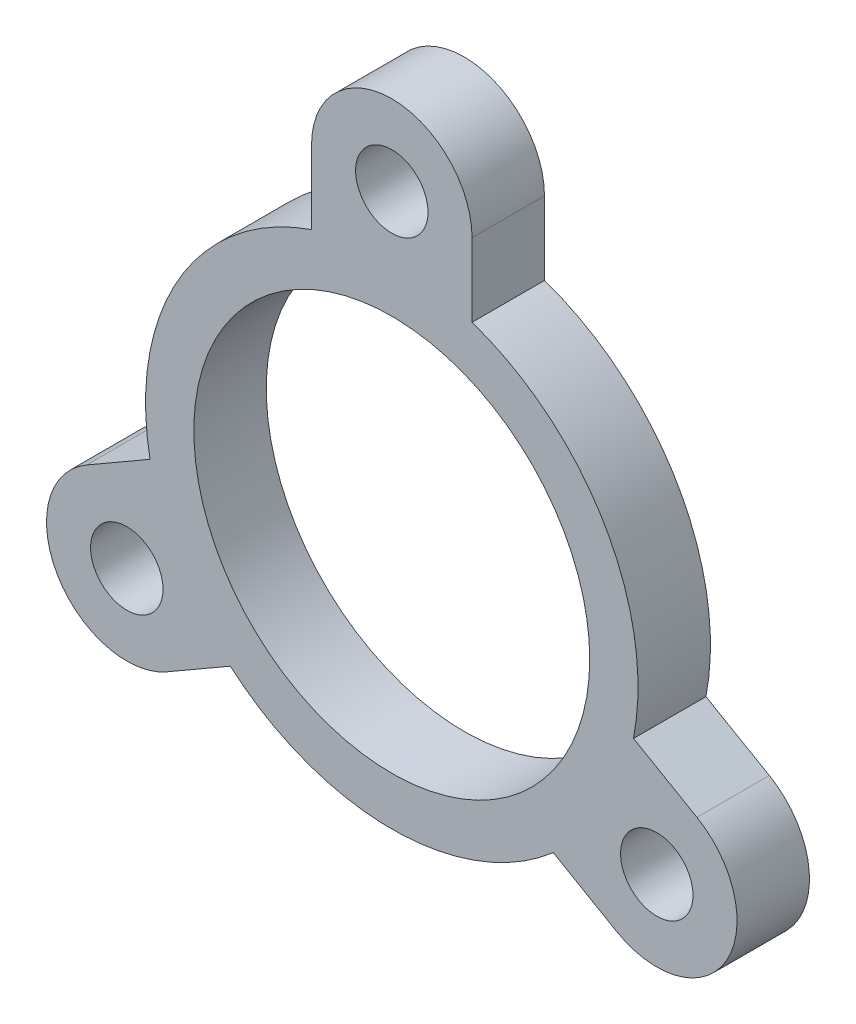
ISO-10303-21;
HEADER;
FILE_DESCRIPTION(('STEP AP214'),'2;1');
FILE_NAME('part.step','',(''),(''),'','','');
FILE_SCHEMA(('AUTOMOTIVE_DESIGN { 1 0 10303 214 1 1 1 1 }'));
ENDSEC;
DATA;
#1=APPLICATION_CONTEXT('core data for automotive mechanical design processes');
#2=APPLICATION_PROTOCOL_DEFINITION('international standard','automotive_design',2000,#1);
#3=PRODUCT_CONTEXT('',#1,'mechanical');
#4=PRODUCT('Part','Part','',(#3));
#5=PRODUCT_RELATED_PRODUCT_CATEGORY('part','',(#4));
#6=PRODUCT_DEFINITION_FORMATION('','',#4);
#7=PRODUCT_DEFINITION_CONTEXT('part definition',#1,'design');
#8=PRODUCT_DEFINITION('design','',#6,#7);
#9=PRODUCT_DEFINITION_SHAPE('','',#8);
#10=(LENGTH_UNIT() NAMED_UNIT(*) SI_UNIT(.MILLI.,.METRE.));
#11=(NAMED_UNIT(*) PLANE_ANGLE_UNIT() SI_UNIT($,.RADIAN.));
#12=(NAMED_UNIT(*) SI_UNIT($,.STERADIAN.) SOLID_ANGLE_UNIT());
#13=UNCERTAINTY_MEASURE_WITH_UNIT(LENGTH_MEASURE(1.E-05),#10,'distance_accuracy_value','');
#14=(GEOMETRIC_REPRESENTATION_CONTEXT(3) GLOBAL_UNCERTAINTY_ASSIGNED_CONTEXT((#13)) GLOBAL_UNIT_ASSIGNED_CONTEXT((#10,
#11,#12)) REPRESENTATION_CONTEXT('',''));
#15=CARTESIAN_POINT('',(0.,0.,0.));
#16=DIRECTION('',(0.,0.,1.));
#17=DIRECTION('',(1.,0.,0.));
#18=AXIS2_PLACEMENT_3D('',#15,#16,#17);
#19=CARTESIAN_POINT('',(0.,0.,1.5));
#20=DIRECTION('',(0.,0.,-1.));
#21=DIRECTION('',(-1.,0.,0.));
#22=AXIS2_PLACEMENT_3D('',#19,#20,#21);
#23=CYLINDRICAL_SURFACE('',#22,10.2);
#24=CARTESIAN_POINT('',(0.,0.,-1.5));
#25=DIRECTION('',(0.,0.,1.));
#26=DIRECTION('',(1.,0.,0.));
#27=AXIS2_PLACEMENT_3D('',#24,#25,#26);
#28=CIRCLE('',#27,10.2);
#29=CARTESIAN_POINT('',(-6.6884449315632,-7.70095477180891,-1.5));
#30=VERTEX_POINT('',#29);
#31=CARTESIAN_POINT('',(6.6884449315631,-7.70095477180901,-1.5));
#32=VERTEX_POINT('',#31);
#33=EDGE_CURVE('E170',#30,#32,#28,.T.);
#34=ORIENTED_EDGE('',*,*,#33,.T.);
#35=DIRECTION('',(0.,0.,-1.));
#36=VECTOR('',#35,1.);
#37=CARTESIAN_POINT('',(6.6884449315631,-7.70095477180901,1.5));
#38=LINE('',#37,#36);
#39=CARTESIAN_POINT('',(6.6884449315631,-7.70095477180901,1.5));
#40=VERTEX_POINT('',#39);
#41=EDGE_CURVE('E11',#40,#32,#38,.T.);
#42=ORIENTED_EDGE('',*,*,#41,.F.);
#43=CARTESIAN_POINT('',(0.,0.,1.5));
#44=DIRECTION('',(0.,0.,1.));
#45=DIRECTION('',(1.,0.,0.));
#46=AXIS2_PLACEMENT_3D('',#43,#44,#45);
#47=CIRCLE('',#46,10.2);
#48=CARTESIAN_POINT('',(-6.6884449315632,-7.70095477180891,1.5));
#49=VERTEX_POINT('',#48);
#50=EDGE_CURVE('E104',#49,#40,#47,.T.);
#51=ORIENTED_EDGE('',*,*,#50,.F.);
#52=DIRECTION('',(0.,0.,-1.));
#53=VECTOR('',#52,1.);
#54=CARTESIAN_POINT('',(-6.6884449315632,-7.70095477180891,1.5));
#55=LINE('',#54,#53);
#56=EDGE_CURVE('E166',#49,#30,#55,.T.);
#57=ORIENTED_EDGE('',*,*,#56,.T.);
#58=EDGE_LOOP('',(#34,#42,#51,#57));
#59=FACE_BOUND('',#58,.T.);
#60=ADVANCED_FACE('F36',(#59),#23,.T.);
#61=CARTESIAN_POINT('',(-1.66250000000001,-2.87953446758325,1.5));
#62=DIRECTION('',(-0.500000000000004,-0.866025403784436,0.));
#63=DIRECTION('',(0.866025403784436,-0.500000000000004,0.));
#64=AXIS2_PLACEMENT_3D('',#61,#62,#63);
#65=PLANE('',#64);
#66=DIRECTION('',(-0.866025403784436,0.500000000000004,0.));
#67=VECTOR('',#66,1.);
#68=CARTESIAN_POINT('',(-1.66250000000001,-2.87953446758325,-1.5));
#69=LINE('',#68,#67);
#70=CARTESIAN_POINT('',(9.31437199296772,-9.2170344675833,-1.5));
#71=VERTEX_POINT('',#70);
#72=EDGE_CURVE('E173',#71,#32,#69,.T.);
#73=ORIENTED_EDGE('',*,*,#72,.F.);
#74=DIRECTION('',(0.,0.,-1.));
#75=VECTOR('',#74,1.);
#76=CARTESIAN_POINT('',(9.31437199296772,-9.2170344675833,1.5));
#77=LINE('',#76,#75);
#78=CARTESIAN_POINT('',(9.31437199296772,-9.2170344675833,1.5));
#79=VERTEX_POINT('',#78);
#80=EDGE_CURVE('E45',#79,#71,#77,.T.);
#81=ORIENTED_EDGE('',*,*,#80,.F.);
#82=DIRECTION('',(-0.866025403784436,0.500000000000004,0.));
#83=VECTOR('',#82,1.);
#84=CARTESIAN_POINT('',(-1.66250000000001,-2.87953446758325,1.5));
#85=LINE('',#84,#83);
#86=EDGE_CURVE('E240',#79,#40,#85,.T.);
#87=ORIENTED_EDGE('',*,*,#86,.T.);
#88=ORIENTED_EDGE('',*,*,#41,.T.);
#89=EDGE_LOOP('',(#73,#81,#87,#88));
#90=FACE_BOUND('',#89,.T.);
#91=ADVANCED_FACE('F239',(#90),#65,.T.);
#92=CARTESIAN_POINT('',(10.9768719929677,-6.33750000000005,1.5));
#93=DIRECTION('',(0.,0.,-1.));
#94=DIRECTION('',(-1.,0.,0.));
#95=AXIS2_PLACEMENT_3D('',#92,#93,#94);
#96=CYLINDRICAL_SURFACE('',#95,3.325);
#97=CARTESIAN_POINT('',(10.9768719929677,-6.33750000000005,-1.5));
#98=DIRECTION('',(0.,0.,1.));
#99=DIRECTION('',(1.,0.,0.));
#100=AXIS2_PLACEMENT_3D('',#97,#98,#99);
#101=CIRCLE('',#100,3.325);
#102=CARTESIAN_POINT('',(12.6393719929677,-3.4579655324168,-1.5));
#103=VERTEX_POINT('',#102);
#104=EDGE_CURVE('E176',#71,#103,#101,.T.);
#105=ORIENTED_EDGE('',*,*,#104,.T.);
#106=DIRECTION('',(0.,0.,-1.));
#107=VECTOR('',#106,1.);
#108=CARTESIAN_POINT('',(12.6393719929677,-3.4579655324168,1.5));
#109=LINE('',#108,#107);
#110=CARTESIAN_POINT('',(12.6393719929677,-3.4579655324168,1.5));
#111=VERTEX_POINT('',#110);
#112=EDGE_CURVE('E222',#111,#103,#109,.T.);
#113=ORIENTED_EDGE('',*,*,#112,.F.);
#114=CARTESIAN_POINT('',(10.9768719929677,-6.33750000000005,1.5));
#115=DIRECTION('',(0.,0.,1.));
#116=DIRECTION('',(1.,0.,0.));
#117=AXIS2_PLACEMENT_3D('',#114,#115,#116);
#118=CIRCLE('',#117,3.325);
#119=EDGE_CURVE('E229',#79,#111,#118,.T.);
#120=ORIENTED_EDGE('',*,*,#119,.F.);
#121=ORIENTED_EDGE('',*,*,#80,.T.);
#122=EDGE_LOOP('',(#105,#113,#120,#121));
#123=FACE_BOUND('',#122,.T.);
#124=ADVANCED_FACE('F227',(#123),#96,.T.);
#125=CARTESIAN_POINT('',(1.66250000000001,2.87953446758325,1.5));
#126=DIRECTION('',(-0.500000000000004,-0.866025403784436,0.));
#127=DIRECTION('',(0.866025403784436,-0.500000000000004,0.));
#128=AXIS2_PLACEMENT_3D('',#125,#126,#127);
#129=PLANE('',#128);
#130=DIRECTION('',(-0.866025403784436,0.500000000000004,0.));
#131=VECTOR('',#130,1.);
#132=CARTESIAN_POINT('',(1.66250000000001,2.87953446758325,-1.5));
#133=LINE('',#132,#131);
#134=CARTESIAN_POINT('',(10.0134449315631,-1.9418858366425,-1.5));
#135=VERTEX_POINT('',#134);
#136=EDGE_CURVE('E178',#103,#135,#133,.T.);
#137=ORIENTED_EDGE('',*,*,#136,.T.);
#138=DIRECTION('',(0.,0.,-1.));
#139=VECTOR('',#138,1.);
#140=CARTESIAN_POINT('',(10.0134449315631,-1.9418858366425,1.5));
#141=LINE('',#140,#139);
#142=CARTESIAN_POINT('',(10.0134449315631,-1.9418858366425,1.5));
#143=VERTEX_POINT('',#142);
#144=EDGE_CURVE('E219',#143,#135,#141,.T.);
#145=ORIENTED_EDGE('',*,*,#144,.F.);
#146=DIRECTION('',(-0.866025403784436,0.500000000000004,0.));
#147=VECTOR('',#146,1.);
#148=CARTESIAN_POINT('',(1.66250000000001,2.87953446758325,1.5));
#149=LINE('',#148,#147);
#150=EDGE_CURVE('E271',#111,#143,#149,.T.);
#151=ORIENTED_EDGE('',*,*,#150,.F.);
#152=ORIENTED_EDGE('',*,*,#112,.T.);
#153=EDGE_LOOP('',(#137,#145,#151,#152));
#154=FACE_BOUND('',#153,.T.);
#155=ADVANCED_FACE('F270',(#154),#129,.F.);
#156=CARTESIAN_POINT('',(0.,0.,1.5));
#157=DIRECTION('',(0.,0.,-1.));
#158=DIRECTION('',(-1.,0.,0.));
#159=AXIS2_PLACEMENT_3D('',#156,#157,#158);
#160=CYLINDRICAL_SURFACE('',#159,10.2);
#161=CARTESIAN_POINT('',(0.,0.,-1.5));
#162=DIRECTION('',(0.,0.,1.));
#163=DIRECTION('',(1.,0.,0.));
#164=AXIS2_PLACEMENT_3D('',#161,#162,#163);
#165=CIRCLE('',#164,10.2);
#166=CARTESIAN_POINT('',(3.325,9.64284060845143,-1.5));
#167=VERTEX_POINT('',#166);
#168=EDGE_CURVE('E180',#135,#167,#165,.T.);
#169=ORIENTED_EDGE('',*,*,#168,.T.);
#170=DIRECTION('',(0.,0.,-1.));
#171=VECTOR('',#170,1.);
#172=CARTESIAN_POINT('',(3.325,9.64284060845143,1.5));
#173=LINE('',#172,#171);
#174=CARTESIAN_POINT('',(3.325,9.64284060845143,1.5));
#175=VERTEX_POINT('',#174);
#176=EDGE_CURVE('E217',#175,#167,#173,.T.);
#177=ORIENTED_EDGE('',*,*,#176,.F.);
#178=CARTESIAN_POINT('',(0.,0.,1.5));
#179=DIRECTION('',(0.,0.,1.));
#180=DIRECTION('',(1.,0.,0.));
#181=AXIS2_PLACEMENT_3D('',#178,#179,#180);
#182=CIRCLE('',#181,10.2);
#183=EDGE_CURVE('E267',#143,#175,#182,.T.);
#184=ORIENTED_EDGE('',*,*,#183,.F.);
#185=ORIENTED_EDGE('',*,*,#144,.T.);
#186=EDGE_LOOP('',(#169,#177,#184,#185));
#187=FACE_BOUND('',#186,.T.);
#188=ADVANCED_FACE('F265',(#187),#160,.T.);
#189=CARTESIAN_POINT('',(3.325,0.,1.5));
#190=DIRECTION('',(1.,0.,0.));
#191=DIRECTION('',(0.,1.,0.));
#192=AXIS2_PLACEMENT_3D('',#189,#190,#191);
#193=PLANE('',#192);
#194=DIRECTION('',(0.,-1.,0.));
#195=VECTOR('',#194,1.);
#196=CARTESIAN_POINT('',(3.325,0.,-1.5));
#197=LINE('',#196,#195);
#198=CARTESIAN_POINT('',(3.325,12.675,-1.5));
#199=VERTEX_POINT('',#198);
#200=EDGE_CURVE('E183',#199,#167,#197,.T.);
#201=ORIENTED_EDGE('',*,*,#200,.F.);
#202=DIRECTION('',(0.,0.,-1.));
#203=VECTOR('',#202,1.);
#204=CARTESIAN_POINT('',(3.325,12.675,1.5));
#205=LINE('',#204,#203);
#206=CARTESIAN_POINT('',(3.325,12.675,1.5));
#207=VERTEX_POINT('',#206);
#208=EDGE_CURVE('E215',#207,#199,#205,.T.);
#209=ORIENTED_EDGE('',*,*,#208,.F.);
#210=DIRECTION('',(0.,-1.,0.));
#211=VECTOR('',#210,1.);
#212=CARTESIAN_POINT('',(3.325,0.,1.5));
#213=LINE('',#212,#211);
#214=EDGE_CURVE('E262',#207,#175,#213,.T.);
#215=ORIENTED_EDGE('',*,*,#214,.T.);
#216=ORIENTED_EDGE('',*,*,#176,.T.);
#217=EDGE_LOOP('',(#201,#209,#215,#216));
#218=FACE_BOUND('',#217,.T.);
#219=ADVANCED_FACE('F259',(#218),#193,.T.);
#220=CARTESIAN_POINT('',(0.,12.675,1.5));
#221=DIRECTION('',(0.,0.,-1.));
#222=DIRECTION('',(-1.,0.,0.));
#223=AXIS2_PLACEMENT_3D('',#220,#221,#222);
#224=CYLINDRICAL_SURFACE('',#223,3.325);
#225=CARTESIAN_POINT('',(0.,12.675,-1.5));
#226=DIRECTION('',(0.,0.,1.));
#227=DIRECTION('',(1.,0.,0.));
#228=AXIS2_PLACEMENT_3D('',#225,#226,#227);
#229=CIRCLE('',#228,3.325);
#230=CARTESIAN_POINT('',(-3.325,12.675,-1.5));
#231=VERTEX_POINT('',#230);
#232=EDGE_CURVE('E186',#199,#231,#229,.T.);
#233=ORIENTED_EDGE('',*,*,#232,.T.);
#234=DIRECTION('',(0.,0.,-1.));
#235=VECTOR('',#234,1.);
#236=CARTESIAN_POINT('',(-3.325,12.675,1.5));
#237=LINE('',#236,#235);
#238=CARTESIAN_POINT('',(-3.325,12.675,1.5));
#239=VERTEX_POINT('',#238);
#240=EDGE_CURVE('E212',#239,#231,#237,.T.);
#241=ORIENTED_EDGE('',*,*,#240,.F.);
#242=CARTESIAN_POINT('',(0.,12.675,1.5));
#243=DIRECTION('',(0.,0.,1.));
#244=DIRECTION('',(1.,0.,0.));
#245=AXIS2_PLACEMENT_3D('',#242,#243,#244);
#246=CIRCLE('',#245,3.325);
#247=EDGE_CURVE('E255',#207,#239,#246,.T.);
#248=ORIENTED_EDGE('',*,*,#247,.F.);
#249=ORIENTED_EDGE('',*,*,#208,.T.);
#250=EDGE_LOOP('',(#233,#241,#248,#249));
#251=FACE_BOUND('',#250,.T.);
#252=ADVANCED_FACE('F254',(#251),#224,.T.);
#253=CARTESIAN_POINT('',(-3.325,0.,1.5));
#254=DIRECTION('',(1.,0.,0.));
#255=DIRECTION('',(0.,1.,0.));
#256=AXIS2_PLACEMENT_3D('',#253,#254,#255);
#257=PLANE('',#256);
#258=DIRECTION('',(0.,-1.,0.));
#259=VECTOR('',#258,1.);
#260=CARTESIAN_POINT('',(-3.325,0.,-1.5));
#261=LINE('',#260,#259);
#262=CARTESIAN_POINT('',(-3.325,9.64284060845143,-1.5));
#263=VERTEX_POINT('',#262);
#264=EDGE_CURVE('E188',#231,#263,#261,.T.);
#265=ORIENTED_EDGE('',*,*,#264,.T.);
#266=DIRECTION('',(0.,0.,-1.));
#267=VECTOR('',#266,1.);
#268=CARTESIAN_POINT('',(-3.325,9.64284060845143,1.5));
#269=LINE('',#268,#267);
#270=CARTESIAN_POINT('',(-3.325,9.64284060845143,1.5));
#271=VERTEX_POINT('',#270);
#272=EDGE_CURVE('E209',#271,#263,#269,.T.);
#273=ORIENTED_EDGE('',*,*,#272,.F.);
#274=DIRECTION('',(0.,-1.,0.));
#275=VECTOR('',#274,1.);
#276=CARTESIAN_POINT('',(-3.325,0.,1.5));
#277=LINE('',#276,#275);
#278=EDGE_CURVE('E152',#239,#271,#277,.T.);
#279=ORIENTED_EDGE('',*,*,#278,.F.);
#280=ORIENTED_EDGE('',*,*,#240,.T.);
#281=EDGE_LOOP('',(#265,#273,#279,#280));
#282=FACE_BOUND('',#281,.T.);
#283=ADVANCED_FACE('F250',(#282),#257,.F.);
#284=CARTESIAN_POINT('',(0.,0.,1.5));
#285=DIRECTION('',(0.,0.,-1.));
#286=DIRECTION('',(-1.,0.,0.));
#287=AXIS2_PLACEMENT_3D('',#284,#285,#286);
#288=CYLINDRICAL_SURFACE('',#287,10.2);
#289=CARTESIAN_POINT('',(0.,0.,-1.5));
#290=DIRECTION('',(0.,0.,1.));
#291=DIRECTION('',(1.,0.,0.));
#292=AXIS2_PLACEMENT_3D('',#289,#290,#291);
#293=CIRCLE('',#292,10.2);
#294=CARTESIAN_POINT('',(-10.0134449315632,-1.94188583664236,-1.5));
#295=VERTEX_POINT('',#294);
#296=EDGE_CURVE('E190',#263,#295,#293,.T.);
#297=ORIENTED_EDGE('',*,*,#296,.T.);
#298=DIRECTION('',(0.,0.,-1.));
#299=VECTOR('',#298,1.);
#300=CARTESIAN_POINT('',(-10.0134449315632,-1.94188583664236,1.5));
#301=LINE('',#300,#299);
#302=CARTESIAN_POINT('',(-10.0134449315632,-1.94188583664236,1.5));
#303=VERTEX_POINT('',#302);
#304=EDGE_CURVE('E140',#303,#295,#301,.T.);
#305=ORIENTED_EDGE('',*,*,#304,.F.);
#306=CARTESIAN_POINT('',(0.,0.,1.5));
#307=DIRECTION('',(0.,0.,1.));
#308=DIRECTION('',(1.,0.,0.));
#309=AXIS2_PLACEMENT_3D('',#306,#307,#308);
#310=CIRCLE('',#309,10.2);
#311=EDGE_CURVE('E149',#271,#303,#310,.T.);
#312=ORIENTED_EDGE('',*,*,#311,.F.);
#313=ORIENTED_EDGE('',*,*,#272,.T.);
#314=EDGE_LOOP('',(#297,#305,#312,#313));
#315=FACE_BOUND('',#314,.T.);
#316=ADVANCED_FACE('F246',(#315),#288,.T.);
#317=CARTESIAN_POINT('',(-1.66249999999998,2.87953446758328,1.5));
#318=DIRECTION('',(-0.499999999999992,0.866025403784443,0.));
#319=DIRECTION('',(-0.866025403784443,-0.499999999999992,0.));
#320=AXIS2_PLACEMENT_3D('',#317,#318,#319);
#321=PLANE('',#320);
#322=DIRECTION('',(0.866025403784443,0.499999999999992,0.));
#323=VECTOR('',#322,1.);
#324=CARTESIAN_POINT('',(-1.66249999999998,2.87953446758328,-1.5));
#325=LINE('',#324,#323);
#326=CARTESIAN_POINT('',(-12.6393719929678,-3.45796553241662,-1.5));
#327=VERTEX_POINT('',#326);
#328=EDGE_CURVE('E139',#327,#295,#325,.T.);
#329=ORIENTED_EDGE('',*,*,#328,.F.);
#330=DIRECTION('',(0.,0.,-1.));
#331=VECTOR('',#330,1.);
#332=CARTESIAN_POINT('',(-12.6393719929678,-3.45796553241662,1.5));
#333=LINE('',#332,#331);
#334=CARTESIAN_POINT('',(-12.6393719929678,-3.45796553241662,1.5));
#335=VERTEX_POINT('',#334);
#336=EDGE_CURVE('E133',#335,#327,#333,.T.);
#337=ORIENTED_EDGE('',*,*,#336,.F.);
#338=DIRECTION('',(0.866025403784443,0.499999999999992,0.));
#339=VECTOR('',#338,1.);
#340=CARTESIAN_POINT('',(-1.66249999999998,2.87953446758328,1.5));
#341=LINE('',#340,#339);
#342=EDGE_CURVE('E137',#335,#303,#341,.T.);
#343=ORIENTED_EDGE('',*,*,#342,.T.);
#344=ORIENTED_EDGE('',*,*,#304,.T.);
#345=EDGE_LOOP('',(#329,#337,#343,#344));
#346=FACE_BOUND('',#345,.T.);
#347=ADVANCED_FACE('F135',(#346),#321,.T.);
#348=CARTESIAN_POINT('',(-10.9768719929678,-6.3374999999999,1.5));
#349=DIRECTION('',(0.,0.,-1.));
#350=DIRECTION('',(-1.,0.,0.));
#351=AXIS2_PLACEMENT_3D('',#348,#349,#350);
#352=CYLINDRICAL_SURFACE('',#351,3.325);
#353=CARTESIAN_POINT('',(-10.9768719929678,-6.3374999999999,-1.5));
#354=DIRECTION('',(0.,0.,1.));
#355=DIRECTION('',(1.,0.,0.));
#356=AXIS2_PLACEMENT_3D('',#353,#354,#355);
#357=CIRCLE('',#356,3.325);
#358=CARTESIAN_POINT('',(-9.31437199296784,-9.21703446758317,-1.5));
#359=VERTEX_POINT('',#358);
#360=EDGE_CURVE('E92',#327,#359,#357,.T.);
#361=ORIENTED_EDGE('',*,*,#360,.T.);
#362=DIRECTION('',(0.,0.,-1.));
#363=VECTOR('',#362,1.);
#364=CARTESIAN_POINT('',(-9.31437199296784,-9.21703446758317,1.5));
#365=LINE('',#364,#363);
#366=CARTESIAN_POINT('',(-9.31437199296784,-9.21703446758317,1.5));
#367=VERTEX_POINT('',#366);
#368=EDGE_CURVE('E141',#367,#359,#365,.T.);
#369=ORIENTED_EDGE('',*,*,#368,.F.);
#370=CARTESIAN_POINT('',(-10.9768719929678,-6.3374999999999,1.5));
#371=DIRECTION('',(0.,0.,1.));
#372=DIRECTION('',(1.,0.,0.));
#373=AXIS2_PLACEMENT_3D('',#370,#371,#372);
#374=CIRCLE('',#373,3.325);
#375=EDGE_CURVE('E143',#335,#367,#374,.T.);
#376=ORIENTED_EDGE('',*,*,#375,.F.);
#377=ORIENTED_EDGE('',*,*,#336,.T.);
#378=EDGE_LOOP('',(#361,#369,#376,#377));
#379=FACE_BOUND('',#378,.T.);
#380=ADVANCED_FACE('F144',(#379),#352,.T.);
#381=CARTESIAN_POINT('',(0.,12.675,1.5));
#382=DIRECTION('',(0.,0.,-1.));
#383=DIRECTION('',(-1.,0.,0.));
#384=AXIS2_PLACEMENT_3D('',#381,#382,#383);
#385=CYLINDRICAL_SURFACE('',#384,1.5);
#386=CARTESIAN_POINT('',(0.,12.675,1.5));
#387=DIRECTION('',(0.,0.,1.));
#388=DIRECTION('',(1.,0.,0.));
#389=AXIS2_PLACEMENT_3D('',#386,#387,#388);
#390=CIRCLE('',#389,1.5);
#391=CARTESIAN_POINT('',(1.5,12.675,1.5));
#392=VERTEX_POINT('',#391);
#393=EDGE_CURVE('E160',#392,#392,#390,.T.);
#394=ORIENTED_EDGE('',*,*,#393,.T.);
#395=EDGE_LOOP('',(#394));
#396=FACE_BOUND('',#395,.T.);
#397=CARTESIAN_POINT('',(0.,12.675,-1.5));
#398=DIRECTION('',(0.,0.,1.));
#399=DIRECTION('',(1.,0.,0.));
#400=AXIS2_PLACEMENT_3D('',#397,#398,#399);
#401=CIRCLE('',#400,1.5);
#402=CARTESIAN_POINT('',(1.5,12.675,-1.5));
#403=VERTEX_POINT('',#402);
#404=EDGE_CURVE('E199',#403,#403,#401,.T.);
#405=ORIENTED_EDGE('',*,*,#404,.F.);
#406=EDGE_LOOP('',(#405));
#407=FACE_BOUND('',#406,.T.);
#408=ADVANCED_FACE('F320',(#396,#407),#385,.F.);
#409=CARTESIAN_POINT('',(-10.9768719929678,-6.3375,1.5));
#410=DIRECTION('',(0.,0.,-1.));
#411=DIRECTION('',(-1.,0.,0.));
#412=AXIS2_PLACEMENT_3D('',#409,#410,#411);
#413=CYLINDRICAL_SURFACE('',#412,1.50000000000012);
#414=CARTESIAN_POINT('',(-10.9768719929678,-6.3375,1.5));
#415=DIRECTION('',(0.,0.,1.));
#416=DIRECTION('',(1.,0.,0.));
#417=AXIS2_PLACEMENT_3D('',#414,#415,#416);
#418=CIRCLE('',#417,1.50000000000012);
#419=CARTESIAN_POINT('',(-9.47687199296764,-6.3375,1.5));
#420=VERTEX_POINT('',#419);
#421=EDGE_CURVE('E157',#420,#420,#418,.T.);
#422=ORIENTED_EDGE('',*,*,#421,.T.);
#423=EDGE_LOOP('',(#422));
#424=FACE_BOUND('',#423,.T.);
#425=CARTESIAN_POINT('',(-10.9768719929678,-6.3375,-1.5));
#426=DIRECTION('',(0.,0.,1.));
#427=DIRECTION('',(1.,0.,0.));
#428=AXIS2_PLACEMENT_3D('',#425,#426,#427);
#429=CIRCLE('',#428,1.50000000000012);
#430=CARTESIAN_POINT('',(-9.47687199296764,-6.3375,-1.5));
#431=VERTEX_POINT('',#430);
#432=EDGE_CURVE('E196',#431,#431,#429,.T.);
#433=ORIENTED_EDGE('',*,*,#432,.F.);
#434=EDGE_LOOP('',(#433));
#435=FACE_BOUND('',#434,.T.);
#436=ADVANCED_FACE('F324',(#424,#435),#413,.F.);
#437=CARTESIAN_POINT('',(1.66249999999997,-2.87953446758327,1.5));
#438=DIRECTION('',(-0.499999999999992,0.866025403784443,0.));
#439=DIRECTION('',(-0.866025403784443,-0.499999999999992,0.));
#440=AXIS2_PLACEMENT_3D('',#437,#438,#439);
#441=PLANE('',#440);
#442=DIRECTION('',(0.866025403784443,0.499999999999992,0.));
#443=VECTOR('',#442,1.);
#444=CARTESIAN_POINT('',(1.66249999999997,-2.87953446758327,-1.5));
#445=LINE('',#444,#443);
#446=EDGE_CURVE('E98',#359,#30,#445,.T.);
#447=ORIENTED_EDGE('',*,*,#446,.T.);
#448=ORIENTED_EDGE('',*,*,#56,.F.);
#449=DIRECTION('',(0.866025403784443,0.499999999999992,0.));
#450=VECTOR('',#449,1.);
#451=CARTESIAN_POINT('',(1.66249999999997,-2.87953446758327,1.5));
#452=LINE('',#451,#450);
#453=EDGE_CURVE('E53',#367,#49,#452,.T.);
#454=ORIENTED_EDGE('',*,*,#453,.F.);
#455=ORIENTED_EDGE('',*,*,#368,.T.);
#456=EDGE_LOOP('',(#447,#448,#454,#455));
#457=FACE_BOUND('',#456,.T.);
#458=ADVANCED_FACE('F321',(#457),#441,.F.);
#459=CARTESIAN_POINT('',(0.,0.,1.5));
#460=DIRECTION('',(0.,0.,-1.));
#461=DIRECTION('',(-1.,0.,0.));
#462=AXIS2_PLACEMENT_3D('',#459,#460,#461);
#463=CYLINDRICAL_SURFACE('',#462,8.2);
#464=CARTESIAN_POINT('',(0.,0.,1.5));
#465=DIRECTION('',(0.,0.,1.));
#466=DIRECTION('',(1.,0.,0.));
#467=AXIS2_PLACEMENT_3D('',#464,#465,#466);
#468=CIRCLE('',#467,8.2);
#469=CARTESIAN_POINT('',(8.2,0.,1.5));
#470=VERTEX_POINT('',#469);
#471=EDGE_CURVE('E205',#470,#470,#468,.T.);
#472=ORIENTED_EDGE('',*,*,#471,.T.);
#473=EDGE_LOOP('',(#472));
#474=FACE_BOUND('',#473,.T.);
#475=CARTESIAN_POINT('',(0.,0.,-1.5));
#476=DIRECTION('',(0.,0.,1.));
#477=DIRECTION('',(1.,0.,0.));
#478=AXIS2_PLACEMENT_3D('',#475,#476,#477);
#479=CIRCLE('',#478,8.2);
#480=CARTESIAN_POINT('',(8.2,0.,-1.5));
#481=VERTEX_POINT('',#480);
#482=EDGE_CURVE('E167',#481,#481,#479,.T.);
#483=ORIENTED_EDGE('',*,*,#482,.F.);
#484=EDGE_LOOP('',(#483));
#485=FACE_BOUND('',#484,.T.);
#486=ADVANCED_FACE('F38',(#474,#485),#463,.F.);
#487=CARTESIAN_POINT('',(10.9768719929678,-6.3375,1.5));
#488=DIRECTION('',(0.,0.,-1.));
#489=DIRECTION('',(-1.,0.,0.));
#490=AXIS2_PLACEMENT_3D('',#487,#488,#489);
#491=CYLINDRICAL_SURFACE('',#490,1.50000000000006);
#492=CARTESIAN_POINT('',(10.9768719929678,-6.3375,1.5));
#493=DIRECTION('',(0.,0.,1.));
#494=DIRECTION('',(1.,0.,0.));
#495=AXIS2_PLACEMENT_3D('',#492,#493,#494);
#496=CIRCLE('',#495,1.50000000000006);
#497=CARTESIAN_POINT('',(12.4768719929678,-6.3375,1.5));
#498=VERTEX_POINT('',#497);
#499=EDGE_CURVE('E163',#498,#498,#496,.T.);
#500=ORIENTED_EDGE('',*,*,#499,.T.);
#501=EDGE_LOOP('',(#500));
#502=FACE_BOUND('',#501,.T.);
#503=CARTESIAN_POINT('',(10.9768719929678,-6.3375,-1.5));
#504=DIRECTION('',(0.,0.,1.));
#505=DIRECTION('',(1.,0.,0.));
#506=AXIS2_PLACEMENT_3D('',#503,#504,#505);
#507=CIRCLE('',#506,1.50000000000006);
#508=CARTESIAN_POINT('',(12.4768719929678,-6.3375,-1.5));
#509=VERTEX_POINT('',#508);
#510=EDGE_CURVE('E202',#509,#509,#507,.T.);
#511=ORIENTED_EDGE('',*,*,#510,.F.);
#512=EDGE_LOOP('',(#511));
#513=FACE_BOUND('',#512,.T.);
#514=ADVANCED_FACE('F286',(#502,#513),#491,.F.);
#515=CARTESIAN_POINT('',(0.,0.,1.5));
#516=DIRECTION('',(0.,0.,1.));
#517=DIRECTION('',(1.,0.,0.));
#518=AXIS2_PLACEMENT_3D('',#515,#516,#517);
#519=PLANE('',#518);
#520=ORIENTED_EDGE('',*,*,#471,.F.);
#521=EDGE_LOOP('',(#520));
#522=FACE_BOUND('',#521,.T.);
#523=ORIENTED_EDGE('',*,*,#50,.T.);
#524=ORIENTED_EDGE('',*,*,#86,.F.);
#525=ORIENTED_EDGE('',*,*,#119,.T.);
#526=ORIENTED_EDGE('',*,*,#150,.T.);
#527=ORIENTED_EDGE('',*,*,#183,.T.);
#528=ORIENTED_EDGE('',*,*,#214,.F.);
#529=ORIENTED_EDGE('',*,*,#247,.T.);
#530=ORIENTED_EDGE('',*,*,#278,.T.);
#531=ORIENTED_EDGE('',*,*,#311,.T.);
#532=ORIENTED_EDGE('',*,*,#342,.F.);
#533=ORIENTED_EDGE('',*,*,#375,.T.);
#534=ORIENTED_EDGE('',*,*,#453,.T.);
#535=EDGE_LOOP('',(#523,#524,#525,#526,#527,#528,#529,#530,#531,#532,#533,#534));
#536=FACE_BOUND('',#535,.T.);
#537=ORIENTED_EDGE('',*,*,#421,.F.);
#538=EDGE_LOOP('',(#537));
#539=FACE_BOUND('',#538,.T.);
#540=ORIENTED_EDGE('',*,*,#393,.F.);
#541=EDGE_LOOP('',(#540));
#542=FACE_BOUND('',#541,.T.);
#543=ORIENTED_EDGE('',*,*,#499,.F.);
#544=EDGE_LOOP('',(#543));
#545=FACE_BOUND('',#544,.T.);
#546=ADVANCED_FACE('F146',(#522,#536,#539,#542,#545),#519,.T.);
#547=CARTESIAN_POINT('',(0.,0.,-1.5));
#548=DIRECTION('',(0.,0.,1.));
#549=DIRECTION('',(1.,0.,0.));
#550=AXIS2_PLACEMENT_3D('',#547,#548,#549);
#551=PLANE('',#550);
#552=ORIENTED_EDGE('',*,*,#482,.T.);
#553=EDGE_LOOP('',(#552));
#554=FACE_BOUND('',#553,.T.);
#555=ORIENTED_EDGE('',*,*,#33,.F.);
#556=ORIENTED_EDGE('',*,*,#446,.F.);
#557=ORIENTED_EDGE('',*,*,#360,.F.);
#558=ORIENTED_EDGE('',*,*,#328,.T.);
#559=ORIENTED_EDGE('',*,*,#296,.F.);
#560=ORIENTED_EDGE('',*,*,#264,.F.);
#561=ORIENTED_EDGE('',*,*,#232,.F.);
#562=ORIENTED_EDGE('',*,*,#200,.T.);
#563=ORIENTED_EDGE('',*,*,#168,.F.);
#564=ORIENTED_EDGE('',*,*,#136,.F.);
#565=ORIENTED_EDGE('',*,*,#104,.F.);
#566=ORIENTED_EDGE('',*,*,#72,.T.);
#567=EDGE_LOOP('',(#555,#556,#557,#558,#559,#560,#561,#562,#563,#564,#565,#566));
#568=FACE_BOUND('',#567,.T.);
#569=ORIENTED_EDGE('',*,*,#432,.T.);
#570=EDGE_LOOP('',(#569));
#571=FACE_BOUND('',#570,.T.);
#572=ORIENTED_EDGE('',*,*,#404,.T.);
#573=EDGE_LOOP('',(#572));
#574=FACE_BOUND('',#573,.T.);
#575=ORIENTED_EDGE('',*,*,#510,.T.);
#576=EDGE_LOOP('',(#575));
#577=FACE_BOUND('',#576,.T.);
#578=ADVANCED_FACE('F236',(#554,#568,#571,#574,#577),#551,.F.);
#579=CLOSED_SHELL('',(#60,#91,#124,#155,#188,#219,#252,#283,#316,#347,#380,#408,#436,#458,#486,
#514,#546,#578));
#580=MANIFOLD_SOLID_BREP('B2',#579);
#581=ADVANCED_BREP_SHAPE_REPRESENTATION('',(#18,#580),#14);
#582=SHAPE_DEFINITION_REPRESENTATION(#9,#581);
ENDSEC;
END-ISO-10303-21;
